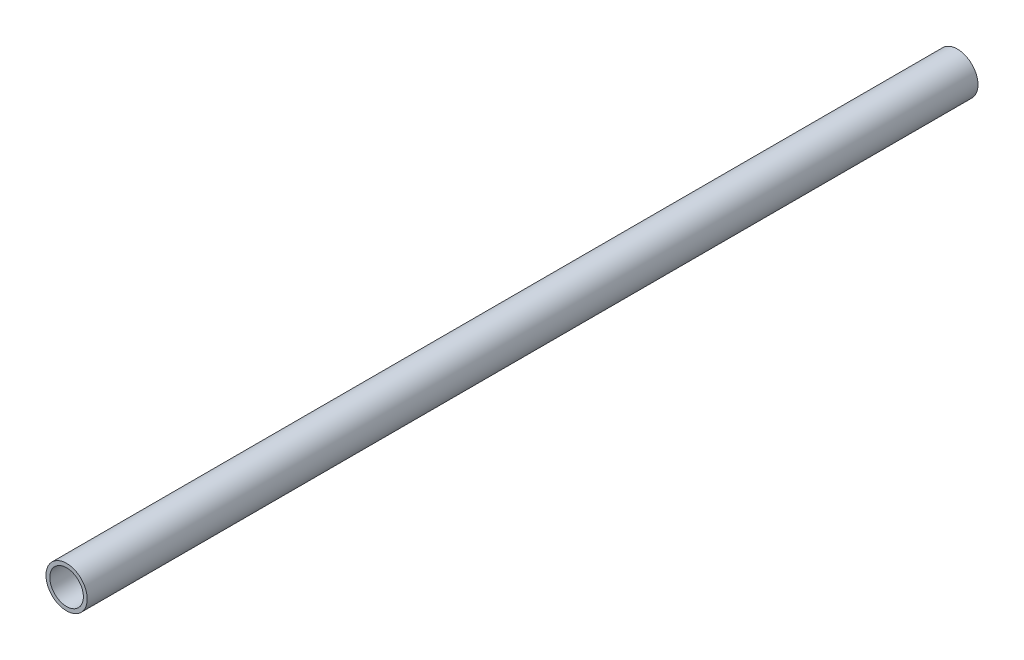
ISO-10303-21;
HEADER;
FILE_DESCRIPTION(('STEP AP214'),'2;1');
FILE_NAME('part.step','',(''),(''),'','','');
FILE_SCHEMA(('AUTOMOTIVE_DESIGN { 1 0 10303 214 1 1 1 1 }'));
ENDSEC;
DATA;
#1=APPLICATION_CONTEXT('core data for automotive mechanical design processes');
#2=APPLICATION_PROTOCOL_DEFINITION('international standard','automotive_design',2000,#1);
#3=PRODUCT_CONTEXT('',#1,'mechanical');
#4=PRODUCT('Part','Part','',(#3));
#5=PRODUCT_RELATED_PRODUCT_CATEGORY('part','',(#4));
#6=PRODUCT_DEFINITION_FORMATION('','',#4);
#7=PRODUCT_DEFINITION_CONTEXT('part definition',#1,'design');
#8=PRODUCT_DEFINITION('design','',#6,#7);
#9=PRODUCT_DEFINITION_SHAPE('','',#8);
#10=(LENGTH_UNIT() NAMED_UNIT(*) SI_UNIT(.MILLI.,.METRE.));
#11=(NAMED_UNIT(*) PLANE_ANGLE_UNIT() SI_UNIT($,.RADIAN.));
#12=(NAMED_UNIT(*) SI_UNIT($,.STERADIAN.) SOLID_ANGLE_UNIT());
#13=UNCERTAINTY_MEASURE_WITH_UNIT(LENGTH_MEASURE(1.E-05),#10,'distance_accuracy_value','');
#14=(GEOMETRIC_REPRESENTATION_CONTEXT(3) GLOBAL_UNCERTAINTY_ASSIGNED_CONTEXT((#13)) GLOBAL_UNIT_ASSIGNED_CONTEXT((#10,
#11,#12)) REPRESENTATION_CONTEXT('',''));
#15=CARTESIAN_POINT('',(0.,0.,0.));
#16=DIRECTION('',(0.,0.,1.));
#17=DIRECTION('',(1.,0.,0.));
#18=AXIS2_PLACEMENT_3D('',#15,#16,#17);
#19=CARTESIAN_POINT('',(0.,0.,175.));
#20=DIRECTION('',(0.,0.,1.));
#21=DIRECTION('',(1.,0.,0.));
#22=AXIS2_PLACEMENT_3D('',#19,#20,#21);
#23=PLANE('',#22);
#24=CARTESIAN_POINT('',(0.,0.,175.));
#25=DIRECTION('',(0.,0.,1.));
#26=DIRECTION('',(1.,0.,0.));
#27=AXIS2_PLACEMENT_3D('',#24,#25,#26);
#28=CIRCLE('',#27,8.1);
#29=CARTESIAN_POINT('',(8.1,0.,175.));
#30=VERTEX_POINT('',#29);
#31=EDGE_CURVE('E10',#30,#30,#28,.T.);
#32=ORIENTED_EDGE('',*,*,#31,.T.);
#33=EDGE_LOOP('',(#32));
#34=FACE_BOUND('',#33,.T.);
#35=CARTESIAN_POINT('',(0.,0.,175.));
#36=DIRECTION('',(0.,0.,1.));
#37=DIRECTION('',(1.,0.,0.));
#38=AXIS2_PLACEMENT_3D('',#35,#36,#37);
#39=CIRCLE('',#38,6.6);
#40=CARTESIAN_POINT('',(6.6,0.,175.));
#41=VERTEX_POINT('',#40);
#42=EDGE_CURVE('E50',#41,#41,#39,.T.);
#43=ORIENTED_EDGE('',*,*,#42,.F.);
#44=EDGE_LOOP('',(#43));
#45=FACE_BOUND('',#44,.T.);
#46=ADVANCED_FACE('F37',(#34,#45),#23,.T.);
#47=CARTESIAN_POINT('',(0.,0.,-175.));
#48=DIRECTION('',(0.,0.,1.));
#49=DIRECTION('',(1.,0.,0.));
#50=AXIS2_PLACEMENT_3D('',#47,#48,#49);
#51=PLANE('',#50);
#52=CARTESIAN_POINT('',(0.,0.,-175.));
#53=DIRECTION('',(0.,0.,1.));
#54=DIRECTION('',(1.,0.,0.));
#55=AXIS2_PLACEMENT_3D('',#52,#53,#54);
#56=CIRCLE('',#55,8.1);
#57=CARTESIAN_POINT('',(8.1,0.,-175.));
#58=VERTEX_POINT('',#57);
#59=EDGE_CURVE('E41',#58,#58,#56,.T.);
#60=ORIENTED_EDGE('',*,*,#59,.F.);
#61=EDGE_LOOP('',(#60));
#62=FACE_BOUND('',#61,.T.);
#63=CARTESIAN_POINT('',(0.,0.,-175.));
#64=DIRECTION('',(0.,0.,1.));
#65=DIRECTION('',(1.,0.,0.));
#66=AXIS2_PLACEMENT_3D('',#63,#64,#65);
#67=CIRCLE('',#66,6.6);
#68=CARTESIAN_POINT('',(6.6,0.,-175.));
#69=VERTEX_POINT('',#68);
#70=EDGE_CURVE('E52',#69,#69,#67,.T.);
#71=ORIENTED_EDGE('',*,*,#70,.T.);
#72=EDGE_LOOP('',(#71));
#73=FACE_BOUND('',#72,.T.);
#74=ADVANCED_FACE('F64',(#62,#73),#51,.F.);
#75=CARTESIAN_POINT('',(0.,0.,175.));
#76=DIRECTION('',(0.,0.,-1.));
#77=DIRECTION('',(-1.,0.,0.));
#78=AXIS2_PLACEMENT_3D('',#75,#76,#77);
#79=CYLINDRICAL_SURFACE('',#78,8.1);
#80=ORIENTED_EDGE('',*,*,#31,.F.);
#81=EDGE_LOOP('',(#80));
#82=FACE_BOUND('',#81,.T.);
#83=ORIENTED_EDGE('',*,*,#59,.T.);
#84=EDGE_LOOP('',(#83));
#85=FACE_BOUND('',#84,.T.);
#86=ADVANCED_FACE('F39',(#82,#85),#79,.T.);
#87=CARTESIAN_POINT('',(0.,0.,175.));
#88=DIRECTION('',(0.,0.,-1.));
#89=DIRECTION('',(-1.,0.,0.));
#90=AXIS2_PLACEMENT_3D('',#87,#88,#89);
#91=CYLINDRICAL_SURFACE('',#90,6.6);
#92=ORIENTED_EDGE('',*,*,#42,.T.);
#93=EDGE_LOOP('',(#92));
#94=FACE_BOUND('',#93,.T.);
#95=ORIENTED_EDGE('',*,*,#70,.F.);
#96=EDGE_LOOP('',(#95));
#97=FACE_BOUND('',#96,.T.);
#98=ADVANCED_FACE('F60',(#94,#97),#91,.F.);
#99=CLOSED_SHELL('',(#46,#74,#86,#98));
#100=MANIFOLD_SOLID_BREP('B2',#99);
#101=ADVANCED_BREP_SHAPE_REPRESENTATION('',(#18,#100),#14);
#102=SHAPE_DEFINITION_REPRESENTATION(#9,#101);
ENDSEC;
END-ISO-10303-21;
